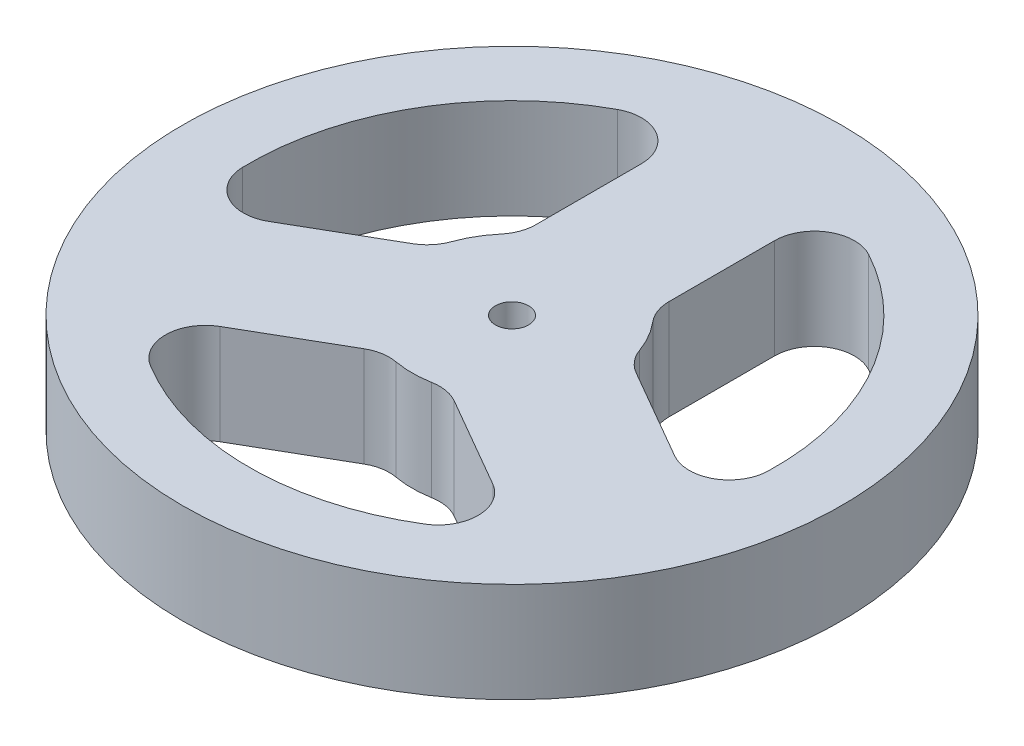
ISO-10303-21;
HEADER;
FILE_DESCRIPTION(('STEP AP214'),'2;1');
FILE_NAME('part.step','',(''),(''),'','','');
FILE_SCHEMA(('AUTOMOTIVE_DESIGN { 1 0 10303 214 1 1 1 1 }'));
ENDSEC;
DATA;
#1=APPLICATION_CONTEXT('core data for automotive mechanical design processes');
#2=APPLICATION_PROTOCOL_DEFINITION('international standard','automotive_design',2000,#1);
#3=PRODUCT_CONTEXT('',#1,'mechanical');
#4=PRODUCT('Part','Part','',(#3));
#5=PRODUCT_RELATED_PRODUCT_CATEGORY('part','',(#4));
#6=PRODUCT_DEFINITION_FORMATION('','',#4);
#7=PRODUCT_DEFINITION_CONTEXT('part definition',#1,'design');
#8=PRODUCT_DEFINITION('design','',#6,#7);
#9=PRODUCT_DEFINITION_SHAPE('','',#8);
#10=(LENGTH_UNIT() NAMED_UNIT(*) SI_UNIT(.MILLI.,.METRE.));
#11=(NAMED_UNIT(*) PLANE_ANGLE_UNIT() SI_UNIT($,.RADIAN.));
#12=(NAMED_UNIT(*) SI_UNIT($,.STERADIAN.) SOLID_ANGLE_UNIT());
#13=UNCERTAINTY_MEASURE_WITH_UNIT(LENGTH_MEASURE(1.E-05),#10,'distance_accuracy_value','');
#14=(GEOMETRIC_REPRESENTATION_CONTEXT(3) GLOBAL_UNCERTAINTY_ASSIGNED_CONTEXT((#13)) GLOBAL_UNIT_ASSIGNED_CONTEXT((#10,
#11,#12)) REPRESENTATION_CONTEXT('',''));
#15=CARTESIAN_POINT('',(0.,0.,0.));
#16=DIRECTION('',(0.,0.,1.));
#17=DIRECTION('',(1.,0.,0.));
#18=AXIS2_PLACEMENT_3D('',#15,#16,#17);
#19=CARTESIAN_POINT('',(0.,15.,0.));
#20=DIRECTION('',(0.,-1.,0.));
#21=DIRECTION('',(0.,0.,-1.));
#22=AXIS2_PLACEMENT_3D('',#19,#20,#21);
#23=CYLINDRICAL_SURFACE('',#22,15.);
#24=CARTESIAN_POINT('',(0.,15.,0.));
#25=DIRECTION('',(0.,1.,0.));
#26=DIRECTION('',(0.,0.,1.));
#27=AXIS2_PLACEMENT_3D('',#24,#25,#26);
#28=CIRCLE('',#27,15.);
#29=CARTESIAN_POINT('',(14.1280135638493,15.,-5.03976514727532));
#30=VERTEX_POINT('',#29);
#31=CARTESIAN_POINT('',(11.4285714285714,15.,-9.71533607766817));
#32=VERTEX_POINT('',#31);
#33=EDGE_CURVE('E358',#30,#32,#28,.T.);
#34=ORIENTED_EDGE('',*,*,#33,.F.);
#35=DIRECTION('',(0.,-1.,0.));
#36=VECTOR('',#35,1.);
#37=CARTESIAN_POINT('',(14.1280135638493,15.,-5.03976514727532));
#38=LINE('',#37,#36);
#39=CARTESIAN_POINT('',(14.1280135638493,0.,-5.03976514727532));
#40=VERTEX_POINT('',#39);
#41=EDGE_CURVE('E243',#30,#40,#38,.T.);
#42=ORIENTED_EDGE('',*,*,#41,.T.);
#43=CARTESIAN_POINT('',(0.,0.,0.));
#44=DIRECTION('',(0.,1.,0.));
#45=DIRECTION('',(0.,0.,1.));
#46=AXIS2_PLACEMENT_3D('',#43,#44,#45);
#47=CIRCLE('',#46,15.);
#48=CARTESIAN_POINT('',(11.4285714285714,0.,-9.71533607766817));
#49=VERTEX_POINT('',#48);
#50=EDGE_CURVE('E337',#40,#49,#47,.T.);
#51=ORIENTED_EDGE('',*,*,#50,.T.);
#52=DIRECTION('',(0.,-1.,0.));
#53=VECTOR('',#52,1.);
#54=CARTESIAN_POINT('',(11.4285714285714,15.,-9.71533607766817));
#55=LINE('',#54,#53);
#56=EDGE_CURVE('E241',#49,#32,#55,.F.);
#57=ORIENTED_EDGE('',*,*,#56,.T.);
#58=EDGE_LOOP('',(#34,#42,#51,#57));
#59=FACE_BOUND('',#58,.T.);
#60=ADVANCED_FACE('F37',(#59),#23,.T.);
#61=CARTESIAN_POINT('',(10.,15.,0.));
#62=DIRECTION('',(1.,0.,0.));
#63=DIRECTION('',(0.,0.,-1.));
#64=AXIS2_PLACEMENT_3D('',#61,#62,#63);
#65=PLANE('',#64);
#66=DIRECTION('',(0.,0.,1.));
#67=VECTOR('',#66,1.);
#68=CARTESIAN_POINT('',(10.,15.,0.));
#69=LINE('',#68,#67);
#70=CARTESIAN_POINT('',(10.,15.,-29.4321253055229));
#71=VERTEX_POINT('',#70);
#72=CARTESIAN_POINT('',(10.,15.,-13.6014705087354));
#73=VERTEX_POINT('',#72);
#74=EDGE_CURVE('E368',#71,#73,#69,.T.);
#75=ORIENTED_EDGE('',*,*,#74,.T.);
#76=DIRECTION('',(0.,-1.,0.));
#77=VECTOR('',#76,1.);
#78=CARTESIAN_POINT('',(10.,15.,-13.6014705087354));
#79=LINE('',#78,#77);
#80=CARTESIAN_POINT('',(10.,0.,-13.6014705087354));
#81=VERTEX_POINT('',#80);
#82=EDGE_CURVE('E267',#73,#81,#79,.T.);
#83=ORIENTED_EDGE('',*,*,#82,.T.);
#84=DIRECTION('',(0.,0.,1.));
#85=VECTOR('',#84,1.);
#86=CARTESIAN_POINT('',(10.,0.,0.));
#87=LINE('',#86,#85);
#88=CARTESIAN_POINT('',(10.,0.,-29.4321253055229));
#89=VERTEX_POINT('',#88);
#90=EDGE_CURVE('E385',#89,#81,#87,.T.);
#91=ORIENTED_EDGE('',*,*,#90,.F.);
#92=DIRECTION('',(0.,1.,0.));
#93=VECTOR('',#92,1.);
#94=CARTESIAN_POINT('',(10.,15.,-29.4321253055229));
#95=LINE('',#94,#93);
#96=EDGE_CURVE('E265',#89,#71,#95,.T.);
#97=ORIENTED_EDGE('',*,*,#96,.T.);
#98=EDGE_LOOP('',(#75,#83,#91,#97));
#99=FACE_BOUND('',#98,.T.);
#100=ADVANCED_FACE('F429',(#99),#65,.T.);
#101=CARTESIAN_POINT('',(0.,15.,0.));
#102=DIRECTION('',(0.,-1.,0.));
#103=DIRECTION('',(0.,0.,-1.));
#104=AXIS2_PLACEMENT_3D('',#101,#102,#103);
#105=CYLINDRICAL_SURFACE('',#104,39.5);
#106=CARTESIAN_POINT('',(0.,0.,0.));
#107=DIRECTION('',(0.,1.,0.));
#108=DIRECTION('',(0.,0.,1.));
#109=AXIS2_PLACEMENT_3D('',#106,#107,#108);
#110=CIRCLE('',#109,39.5);
#111=CARTESIAN_POINT('',(39.4869923575228,0.,1.01362446544014));
#112=VERTEX_POINT('',#111);
#113=CARTESIAN_POINT('',(18.865671641791,0.,-34.7035507333777));
#114=VERTEX_POINT('',#113);
#115=EDGE_CURVE('E340',#112,#114,#110,.T.);
#116=ORIENTED_EDGE('',*,*,#115,.F.);
#117=DIRECTION('',(0.,-1.,0.));
#118=VECTOR('',#117,1.);
#119=CARTESIAN_POINT('',(39.4869923575228,15.,1.01362446544014));
#120=LINE('',#119,#118);
#121=CARTESIAN_POINT('',(39.4869923575228,15.,1.01362446544014));
#122=VERTEX_POINT('',#121);
#123=EDGE_CURVE('E254',#112,#122,#120,.F.);
#124=ORIENTED_EDGE('',*,*,#123,.T.);
#125=CARTESIAN_POINT('',(0.,15.,0.));
#126=DIRECTION('',(0.,1.,0.));
#127=DIRECTION('',(0.,0.,1.));
#128=AXIS2_PLACEMENT_3D('',#125,#126,#127);
#129=CIRCLE('',#128,39.5);
#130=CARTESIAN_POINT('',(18.865671641791,15.,-34.7035507333777));
#131=VERTEX_POINT('',#130);
#132=EDGE_CURVE('E363',#122,#131,#129,.T.);
#133=ORIENTED_EDGE('',*,*,#132,.T.);
#134=DIRECTION('',(0.,-1.,0.));
#135=VECTOR('',#134,1.);
#136=CARTESIAN_POINT('',(18.865671641791,15.,-34.7035507333777));
#137=LINE('',#136,#135);
#138=EDGE_CURVE('E251',#131,#114,#137,.T.);
#139=ORIENTED_EDGE('',*,*,#138,.T.);
#140=EDGE_LOOP('',(#116,#124,#133,#139));
#141=FACE_BOUND('',#140,.T.);
#142=ADVANCED_FACE('F440',(#141),#105,.F.);
#143=CARTESIAN_POINT('',(-9.99999999999999,15.,0.));
#144=DIRECTION('',(1.,0.,0.));
#145=DIRECTION('',(0.,0.,-1.));
#146=AXIS2_PLACEMENT_3D('',#143,#144,#145);
#147=PLANE('',#146);
#148=DIRECTION('',(0.,0.,1.));
#149=VECTOR('',#148,1.);
#150=CARTESIAN_POINT('',(-9.99999999999999,0.,0.));
#151=LINE('',#150,#149);
#152=CARTESIAN_POINT('',(-10.,0.,-29.4321253055229));
#153=VERTEX_POINT('',#152);
#154=CARTESIAN_POINT('',(-10.,0.,-13.6014705087354));
#155=VERTEX_POINT('',#154);
#156=EDGE_CURVE('E332',#153,#155,#151,.T.);
#157=ORIENTED_EDGE('',*,*,#156,.T.);
#158=DIRECTION('',(0.,1.,0.));
#159=VECTOR('',#158,1.);
#160=CARTESIAN_POINT('',(-9.99999999999999,15.,-13.6014705087354));
#161=LINE('',#160,#159);
#162=CARTESIAN_POINT('',(-10.,15.,-13.6014705087354));
#163=VERTEX_POINT('',#162);
#164=EDGE_CURVE('E278',#155,#163,#161,.T.);
#165=ORIENTED_EDGE('',*,*,#164,.T.);
#166=DIRECTION('',(0.,0.,1.));
#167=VECTOR('',#166,1.);
#168=CARTESIAN_POINT('',(-9.99999999999999,15.,0.));
#169=LINE('',#168,#167);
#170=CARTESIAN_POINT('',(-10.,15.,-29.4321253055229));
#171=VERTEX_POINT('',#170);
#172=EDGE_CURVE('E346',#171,#163,#169,.T.);
#173=ORIENTED_EDGE('',*,*,#172,.F.);
#174=DIRECTION('',(0.,-1.,0.));
#175=VECTOR('',#174,1.);
#176=CARTESIAN_POINT('',(-10.,15.,-29.4321253055229));
#177=LINE('',#176,#175);
#178=EDGE_CURVE('E275',#171,#153,#177,.T.);
#179=ORIENTED_EDGE('',*,*,#178,.T.);
#180=EDGE_LOOP('',(#157,#165,#173,#179));
#181=FACE_BOUND('',#180,.T.);
#182=ADVANCED_FACE('F350',(#181),#147,.F.);
#183=CARTESIAN_POINT('',(-11.4285714285714,15.,-9.71533607766817));
#184=VERTEX_POINT('',#183);
#185=CARTESIAN_POINT('',(-14.1280135638507,15.,-5.03976514727127));
#186=VERTEX_POINT('',#185);
#187=EDGE_CURVE('E352',#184,#186,#28,.T.);
#188=ORIENTED_EDGE('',*,*,#187,.F.);
#189=DIRECTION('',(0.,-1.,0.));
#190=VECTOR('',#189,1.);
#191=CARTESIAN_POINT('',(-11.4285714285714,15.,-9.71533607766817));
#192=LINE('',#191,#190);
#193=CARTESIAN_POINT('',(-11.4285714285714,0.,-9.71533607766817));
#194=VERTEX_POINT('',#193);
#195=EDGE_CURVE('E272',#184,#194,#192,.T.);
#196=ORIENTED_EDGE('',*,*,#195,.T.);
#197=CARTESIAN_POINT('',(-14.1280135638507,0.,-5.03976514727127));
#198=VERTEX_POINT('',#197);
#199=EDGE_CURVE('E379',#194,#198,#47,.T.);
#200=ORIENTED_EDGE('',*,*,#199,.T.);
#201=DIRECTION('',(0.,-1.,0.));
#202=VECTOR('',#201,1.);
#203=CARTESIAN_POINT('',(-14.1280135638507,15.,-5.03976514727127));
#204=LINE('',#203,#202);
#205=EDGE_CURVE('E270',#198,#186,#204,.F.);
#206=ORIENTED_EDGE('',*,*,#205,.T.);
#207=EDGE_LOOP('',(#188,#196,#200,#206));
#208=FACE_BOUND('',#207,.T.);
#209=ADVANCED_FACE('F457',(#208),#23,.T.);
#210=CARTESIAN_POINT('',(-4.9999999999988,15.,-8.6602540378423));
#211=DIRECTION('',(-0.500000000000001,0.,-0.866025403784438));
#212=DIRECTION('',(-0.866025403784438,0.,0.500000000000001));
#213=AXIS2_PLACEMENT_3D('',#210,#211,#212);
#214=PLANE('',#213);
#215=DIRECTION('',(0.866025403784438,0.,-0.500000000000001));
#216=VECTOR('',#215,1.);
#217=CARTESIAN_POINT('',(-4.9999999999988,15.,-8.6602540378423));
#218=LINE('',#217,#216);
#219=CARTESIAN_POINT('',(-30.4889682019496,15.,6.05580861491981));
#220=VERTEX_POINT('',#219);
#221=CARTESIAN_POINT('',(-16.779218989391,15.,-1.85951878347315));
#222=VERTEX_POINT('',#221);
#223=EDGE_CURVE('E356',#220,#222,#218,.T.);
#224=ORIENTED_EDGE('',*,*,#223,.T.);
#225=DIRECTION('',(0.,-1.,0.));
#226=VECTOR('',#225,1.);
#227=CARTESIAN_POINT('',(-16.779218989391,15.,-1.85951878347315));
#228=LINE('',#227,#226);
#229=CARTESIAN_POINT('',(-16.779218989391,0.,-1.85951878347315));
#230=VERTEX_POINT('',#229);
#231=EDGE_CURVE('E282',#222,#230,#228,.T.);
#232=ORIENTED_EDGE('',*,*,#231,.T.);
#233=DIRECTION('',(0.866025403784438,0.,-0.500000000000001));
#234=VECTOR('',#233,1.);
#235=CARTESIAN_POINT('',(-4.9999999999988,0.,-8.6602540378423));
#236=LINE('',#235,#234);
#237=CARTESIAN_POINT('',(-30.4889682019496,0.,6.05580861491981));
#238=VERTEX_POINT('',#237);
#239=EDGE_CURVE('E338',#238,#230,#236,.T.);
#240=ORIENTED_EDGE('',*,*,#239,.F.);
#241=DIRECTION('',(0.,1.,0.));
#242=VECTOR('',#241,1.);
#243=CARTESIAN_POINT('',(-30.4889682019496,15.,6.05580861491981));
#244=LINE('',#243,#242);
#245=EDGE_CURVE('E280',#238,#220,#244,.T.);
#246=ORIENTED_EDGE('',*,*,#245,.T.);
#247=EDGE_LOOP('',(#224,#232,#240,#246));
#248=FACE_BOUND('',#247,.T.);
#249=ADVANCED_FACE('F448',(#248),#214,.T.);
#250=CARTESIAN_POINT('',(5.00000000000121,15.,8.66025403784647));
#251=DIRECTION('',(-0.500000000000001,0.,-0.866025403784438));
#252=DIRECTION('',(-0.866025403784438,0.,0.500000000000001));
#253=AXIS2_PLACEMENT_3D('',#250,#251,#252);
#254=PLANE('',#253);
#255=DIRECTION('',(0.866025403784438,0.,-0.500000000000001));
#256=VECTOR('',#255,1.);
#257=CARTESIAN_POINT('',(5.00000000000121,0.,8.66025403784647));
#258=LINE('',#257,#256);
#259=CARTESIAN_POINT('',(-20.4889682019473,0.,23.3763166906073));
#260=VERTEX_POINT('',#259);
#261=CARTESIAN_POINT('',(-6.77921898938609,0.,15.4609892922128));
#262=VERTEX_POINT('',#261);
#263=EDGE_CURVE('E376',#260,#262,#258,.T.);
#264=ORIENTED_EDGE('',*,*,#263,.T.);
#265=DIRECTION('',(0.,1.,0.));
#266=VECTOR('',#265,1.);
#267=CARTESIAN_POINT('',(-6.77921898938608,15.,15.4609892922128));
#268=LINE('',#267,#266);
#269=CARTESIAN_POINT('',(-6.77921898938609,15.,15.4609892922128));
#270=VERTEX_POINT('',#269);
#271=EDGE_CURVE('E263',#262,#270,#268,.T.);
#272=ORIENTED_EDGE('',*,*,#271,.T.);
#273=DIRECTION('',(0.866025403784438,0.,-0.500000000000001));
#274=VECTOR('',#273,1.);
#275=CARTESIAN_POINT('',(5.00000000000121,15.,8.66025403784647));
#276=LINE('',#275,#274);
#277=CARTESIAN_POINT('',(-20.4889682019473,15.,23.3763166906073));
#278=VERTEX_POINT('',#277);
#279=EDGE_CURVE('E395',#278,#270,#276,.T.);
#280=ORIENTED_EDGE('',*,*,#279,.F.);
#281=DIRECTION('',(0.,-1.,0.));
#282=VECTOR('',#281,1.);
#283=CARTESIAN_POINT('',(-20.4889682019473,15.,23.3763166906073));
#284=LINE('',#283,#282);
#285=EDGE_CURVE('E260',#278,#260,#284,.T.);
#286=ORIENTED_EDGE('',*,*,#285,.T.);
#287=EDGE_LOOP('',(#264,#272,#280,#286));
#288=FACE_BOUND('',#287,.T.);
#289=ADVANCED_FACE('F479',(#288),#254,.F.);
#290=CARTESIAN_POINT('',(-2.69944213527577,0.,14.7551012249424));
#291=VERTEX_POINT('',#290);
#292=CARTESIAN_POINT('',(2.69944213527999,0.,14.7551012249417));
#293=VERTEX_POINT('',#292);
#294=EDGE_CURVE('E222',#291,#293,#47,.T.);
#295=ORIENTED_EDGE('',*,*,#294,.T.);
#296=DIRECTION('',(0.,-1.,0.));
#297=VECTOR('',#296,1.);
#298=CARTESIAN_POINT('',(2.69944213528,15.,14.7551012249417));
#299=LINE('',#298,#297);
#300=CARTESIAN_POINT('',(2.69944213527999,15.,14.7551012249417));
#301=VERTEX_POINT('',#300);
#302=EDGE_CURVE('E239',#293,#301,#299,.F.);
#303=ORIENTED_EDGE('',*,*,#302,.T.);
#304=CARTESIAN_POINT('',(-2.69944213527577,15.,14.7551012249424));
#305=VERTEX_POINT('',#304);
#306=EDGE_CURVE('E359',#305,#301,#28,.T.);
#307=ORIENTED_EDGE('',*,*,#306,.F.);
#308=DIRECTION('',(0.,-1.,0.));
#309=VECTOR('',#308,1.);
#310=CARTESIAN_POINT('',(-2.69944213527577,15.,14.7551012249424));
#311=LINE('',#310,#309);
#312=EDGE_CURVE('E228',#305,#291,#311,.T.);
#313=ORIENTED_EDGE('',*,*,#312,.T.);
#314=EDGE_LOOP('',(#295,#303,#307,#313));
#315=FACE_BOUND('',#314,.T.);
#316=ADVANCED_FACE('F411',(#315),#23,.T.);
#317=CARTESIAN_POINT('',(-4.99999999999926,15.,8.66025403784311));
#318=DIRECTION('',(-0.5,0.,0.866025403784439));
#319=DIRECTION('',(0.866025403784439,0.,0.5));
#320=AXIS2_PLACEMENT_3D('',#317,#318,#319);
#321=PLANE('',#320);
#322=DIRECTION('',(-0.866025403784439,0.,-0.5));
#323=VECTOR('',#322,1.);
#324=CARTESIAN_POINT('',(-4.99999999999926,15.,8.66025403784311));
#325=LINE('',#324,#323);
#326=CARTESIAN_POINT('',(20.4889682019511,15.,23.3763166906049));
#327=VERTEX_POINT('',#326);
#328=CARTESIAN_POINT('',(6.77921898939199,15.,15.4609892922117));
#329=VERTEX_POINT('',#328);
#330=EDGE_CURVE('E361',#327,#329,#325,.T.);
#331=ORIENTED_EDGE('',*,*,#330,.T.);
#332=DIRECTION('',(0.,-1.,0.));
#333=VECTOR('',#332,1.);
#334=CARTESIAN_POINT('',(6.77921898939199,15.,15.4609892922117));
#335=LINE('',#334,#333);
#336=CARTESIAN_POINT('',(6.77921898939199,0.,15.4609892922117));
#337=VERTEX_POINT('',#336);
#338=EDGE_CURVE('E221',#329,#337,#335,.T.);
#339=ORIENTED_EDGE('',*,*,#338,.T.);
#340=DIRECTION('',(-0.866025403784439,0.,-0.5));
#341=VECTOR('',#340,1.);
#342=CARTESIAN_POINT('',(-4.99999999999926,0.,8.66025403784311));
#343=LINE('',#342,#341);
#344=CARTESIAN_POINT('',(20.4889682019511,0.,23.3763166906049));
#345=VERTEX_POINT('',#344);
#346=EDGE_CURVE('E204',#345,#337,#343,.T.);
#347=ORIENTED_EDGE('',*,*,#346,.F.);
#348=DIRECTION('',(0.,1.,0.));
#349=VECTOR('',#348,1.);
#350=CARTESIAN_POINT('',(20.4889682019511,15.,23.3763166906049));
#351=LINE('',#350,#349);
#352=EDGE_CURVE('E218',#345,#327,#351,.T.);
#353=ORIENTED_EDGE('',*,*,#352,.T.);
#354=EDGE_LOOP('',(#331,#339,#347,#353));
#355=FACE_BOUND('',#354,.T.);
#356=ADVANCED_FACE('F217',(#355),#321,.T.);
#357=CARTESIAN_POINT('',(0.,15.,0.));
#358=DIRECTION('',(0.,-1.,0.));
#359=DIRECTION('',(0.,0.,-1.));
#360=AXIS2_PLACEMENT_3D('',#357,#358,#359);
#361=CYLINDRICAL_SURFACE('',#360,49.5);
#362=CARTESIAN_POINT('',(0.,15.,0.));
#363=DIRECTION('',(0.,1.,0.));
#364=DIRECTION('',(0.,0.,1.));
#365=AXIS2_PLACEMENT_3D('',#362,#363,#364);
#366=CIRCLE('',#365,49.5);
#367=CARTESIAN_POINT('',(0.,15.,49.5));
#368=VERTEX_POINT('',#367);
#369=EDGE_CURVE('E231',#368,#368,#366,.T.);
#370=ORIENTED_EDGE('',*,*,#369,.F.);
#371=EDGE_LOOP('',(#370));
#372=FACE_BOUND('',#371,.T.);
#373=CARTESIAN_POINT('',(0.,0.,0.));
#374=DIRECTION('',(0.,1.,0.));
#375=DIRECTION('',(0.,0.,1.));
#376=AXIS2_PLACEMENT_3D('',#373,#374,#375);
#377=CIRCLE('',#376,49.5);
#378=CARTESIAN_POINT('',(0.,0.,49.5));
#379=VERTEX_POINT('',#378);
#380=EDGE_CURVE('E390',#379,#379,#377,.T.);
#381=ORIENTED_EDGE('',*,*,#380,.T.);
#382=EDGE_LOOP('',(#381));
#383=FACE_BOUND('',#382,.T.);
#384=ADVANCED_FACE('F494',(#372,#383),#361,.T.);
#385=CARTESIAN_POINT('',(5.00000000000074,15.,-8.66025403784567));
#386=DIRECTION('',(-0.5,0.,0.866025403784439));
#387=DIRECTION('',(0.866025403784439,0.,0.5));
#388=AXIS2_PLACEMENT_3D('',#385,#386,#387);
#389=PLANE('',#388);
#390=DIRECTION('',(-0.866025403784439,0.,-0.5));
#391=VECTOR('',#390,1.);
#392=CARTESIAN_POINT('',(5.00000000000074,0.,-8.66025403784567));
#393=LINE('',#392,#391);
#394=CARTESIAN_POINT('',(30.4889682019497,0.,6.05580861491536));
#395=VERTEX_POINT('',#394);
#396=CARTESIAN_POINT('',(16.779218989389,0.,-1.85951878347882));
#397=VERTEX_POINT('',#396);
#398=EDGE_CURVE('E388',#395,#397,#393,.T.);
#399=ORIENTED_EDGE('',*,*,#398,.T.);
#400=DIRECTION('',(0.,1.,0.));
#401=VECTOR('',#400,1.);
#402=CARTESIAN_POINT('',(16.779218989389,15.,-1.85951878347882));
#403=LINE('',#402,#401);
#404=CARTESIAN_POINT('',(16.779218989389,15.,-1.85951878347882));
#405=VERTEX_POINT('',#404);
#406=EDGE_CURVE('E249',#397,#405,#403,.T.);
#407=ORIENTED_EDGE('',*,*,#406,.T.);
#408=DIRECTION('',(-0.866025403784439,0.,-0.5));
#409=VECTOR('',#408,1.);
#410=CARTESIAN_POINT('',(5.00000000000074,15.,-8.66025403784567));
#411=LINE('',#410,#409);
#412=CARTESIAN_POINT('',(30.4889682019497,15.,6.05580861491536));
#413=VERTEX_POINT('',#412);
#414=EDGE_CURVE('E371',#413,#405,#411,.T.);
#415=ORIENTED_EDGE('',*,*,#414,.F.);
#416=DIRECTION('',(0.,-1.,0.));
#417=VECTOR('',#416,1.);
#418=CARTESIAN_POINT('',(30.4889682019497,15.,6.05580861491536));
#419=LINE('',#418,#417);
#420=EDGE_CURVE('E246',#413,#395,#419,.T.);
#421=ORIENTED_EDGE('',*,*,#420,.T.);
#422=EDGE_LOOP('',(#399,#407,#415,#421));
#423=FACE_BOUND('',#422,.T.);
#424=ADVANCED_FACE('F530',(#423),#389,.F.);
#425=CARTESIAN_POINT('',(-18.865671641791,15.,-34.7035507333777));
#426=VERTEX_POINT('',#425);
#427=CARTESIAN_POINT('',(-39.4869923575226,15.,1.0136244654454));
#428=VERTEX_POINT('',#427);
#429=EDGE_CURVE('E348',#426,#428,#129,.T.);
#430=ORIENTED_EDGE('',*,*,#429,.T.);
#431=DIRECTION('',(0.,-1.,0.));
#432=VECTOR('',#431,1.);
#433=CARTESIAN_POINT('',(-39.4869923575226,15.,1.0136244654454));
#434=LINE('',#433,#432);
#435=CARTESIAN_POINT('',(-39.4869923575226,0.,1.0136244654454));
#436=VERTEX_POINT('',#435);
#437=EDGE_CURVE('E286',#428,#436,#434,.T.);
#438=ORIENTED_EDGE('',*,*,#437,.T.);
#439=CARTESIAN_POINT('',(-18.865671641791,0.,-34.7035507333777));
#440=VERTEX_POINT('',#439);
#441=EDGE_CURVE('E330',#440,#436,#110,.T.);
#442=ORIENTED_EDGE('',*,*,#441,.F.);
#443=DIRECTION('',(0.,-1.,0.));
#444=VECTOR('',#443,1.);
#445=CARTESIAN_POINT('',(-18.865671641791,15.,-34.7035507333777));
#446=LINE('',#445,#444);
#447=EDGE_CURVE('E59',#440,#426,#446,.F.);
#448=ORIENTED_EDGE('',*,*,#447,.T.);
#449=EDGE_LOOP('',(#430,#438,#442,#448));
#450=FACE_BOUND('',#449,.T.);
#451=ADVANCED_FACE('F335',(#450),#105,.F.);
#452=CARTESIAN_POINT('',(-20.6213207157289,15.,33.6899262679373));
#453=VERTEX_POINT('',#452);
#454=CARTESIAN_POINT('',(20.6213207157334,15.,33.6899262679345));
#455=VERTEX_POINT('',#454);
#456=EDGE_CURVE('E353',#453,#455,#129,.T.);
#457=ORIENTED_EDGE('',*,*,#456,.T.);
#458=DIRECTION('',(0.,-1.,0.));
#459=VECTOR('',#458,1.);
#460=CARTESIAN_POINT('',(20.6213207157334,15.,33.6899262679345));
#461=LINE('',#460,#459);
#462=CARTESIAN_POINT('',(20.6213207157334,0.,33.6899262679345));
#463=VERTEX_POINT('',#462);
#464=EDGE_CURVE('E258',#455,#463,#461,.T.);
#465=ORIENTED_EDGE('',*,*,#464,.T.);
#466=CARTESIAN_POINT('',(-20.6213207157289,0.,33.6899262679373));
#467=VERTEX_POINT('',#466);
#468=EDGE_CURVE('E206',#467,#463,#110,.T.);
#469=ORIENTED_EDGE('',*,*,#468,.F.);
#470=DIRECTION('',(0.,-1.,0.));
#471=VECTOR('',#470,1.);
#472=CARTESIAN_POINT('',(-20.6213207157289,15.,33.6899262679373));
#473=LINE('',#472,#471);
#474=EDGE_CURVE('E256',#467,#453,#473,.F.);
#475=ORIENTED_EDGE('',*,*,#474,.T.);
#476=EDGE_LOOP('',(#457,#465,#469,#475));
#477=FACE_BOUND('',#476,.T.);
#478=ADVANCED_FACE('F490',(#477),#105,.F.);
#479=CARTESIAN_POINT('',(0.,15.,0.));
#480=DIRECTION('',(0.,-1.,0.));
#481=DIRECTION('',(0.,0.,-1.));
#482=AXIS2_PLACEMENT_3D('',#479,#480,#481);
#483=CYLINDRICAL_SURFACE('',#482,2.5);
#484=CARTESIAN_POINT('',(0.,15.,0.));
#485=DIRECTION('',(0.,1.,0.));
#486=DIRECTION('',(0.,0.,1.));
#487=AXIS2_PLACEMENT_3D('',#484,#485,#486);
#488=CIRCLE('',#487,2.5);
#489=CARTESIAN_POINT('',(0.,15.,2.5));
#490=VERTEX_POINT('',#489);
#491=EDGE_CURVE('E226',#490,#490,#488,.T.);
#492=ORIENTED_EDGE('',*,*,#491,.T.);
#493=EDGE_LOOP('',(#492));
#494=FACE_BOUND('',#493,.T.);
#495=CARTESIAN_POINT('',(0.,0.,0.));
#496=DIRECTION('',(0.,1.,0.));
#497=DIRECTION('',(0.,0.,1.));
#498=AXIS2_PLACEMENT_3D('',#495,#496,#497);
#499=CIRCLE('',#498,2.5);
#500=CARTESIAN_POINT('',(0.,0.,2.5));
#501=VERTEX_POINT('',#500);
#502=EDGE_CURVE('E234',#501,#501,#499,.T.);
#503=ORIENTED_EDGE('',*,*,#502,.F.);
#504=EDGE_LOOP('',(#503));
#505=FACE_BOUND('',#504,.T.);
#506=ADVANCED_FACE('F518',(#494,#505),#483,.F.);
#507=CARTESIAN_POINT('',(0.,15.,0.));
#508=DIRECTION('',(0.,1.,0.));
#509=DIRECTION('',(0.,0.,1.));
#510=AXIS2_PLACEMENT_3D('',#507,#508,#509);
#511=PLANE('',#510);
#512=ORIENTED_EDGE('',*,*,#456,.F.);
#513=CARTESIAN_POINT('',(-17.4889682019473,15.,28.5724691133139));
#514=DIRECTION('',(0.,1.,0.));
#515=DIRECTION('',(0.,0.,1.));
#516=AXIS2_PLACEMENT_3D('',#513,#514,#515);
#517=CIRCLE('',#516,6.);
#518=EDGE_CURVE('E319',#453,#278,#517,.F.);
#519=ORIENTED_EDGE('',*,*,#518,.T.);
#520=ORIENTED_EDGE('',*,*,#279,.T.);
#521=CARTESIAN_POINT('',(-3.77921898938608,15.,20.6571417149194));
#522=DIRECTION('',(0.,1.,0.));
#523=DIRECTION('',(0.,0.,1.));
#524=AXIS2_PLACEMENT_3D('',#521,#522,#523);
#525=CIRCLE('',#524,6.);
#526=EDGE_CURVE('E303',#270,#305,#525,.F.);
#527=ORIENTED_EDGE('',*,*,#526,.T.);
#528=ORIENTED_EDGE('',*,*,#306,.T.);
#529=CARTESIAN_POINT('',(3.77921898939199,15.,20.6571417149183));
#530=DIRECTION('',(0.,1.,0.));
#531=DIRECTION('',(0.,0.,1.));
#532=AXIS2_PLACEMENT_3D('',#529,#530,#531);
#533=CIRCLE('',#532,6.);
#534=EDGE_CURVE('E291',#301,#329,#533,.F.);
#535=ORIENTED_EDGE('',*,*,#534,.T.);
#536=ORIENTED_EDGE('',*,*,#330,.F.);
#537=CARTESIAN_POINT('',(17.4889682019511,15.,28.5724691133116));
#538=DIRECTION('',(0.,1.,0.));
#539=DIRECTION('',(0.,0.,1.));
#540=AXIS2_PLACEMENT_3D('',#537,#538,#539);
#541=CIRCLE('',#540,6.);
#542=EDGE_CURVE('E211',#327,#455,#541,.F.);
#543=ORIENTED_EDGE('',*,*,#542,.T.);
#544=EDGE_LOOP('',(#512,#519,#520,#527,#528,#535,#536,#543));
#545=FACE_BOUND('',#544,.T.);
#546=ORIENTED_EDGE('',*,*,#429,.F.);
#547=CARTESIAN_POINT('',(-16.,15.,-29.4321253055229));
#548=DIRECTION('',(0.,1.,0.));
#549=DIRECTION('',(0.,0.,1.));
#550=AXIS2_PLACEMENT_3D('',#547,#548,#549);
#551=CIRCLE('',#550,6.);
#552=EDGE_CURVE('E11',#426,#171,#551,.F.);
#553=ORIENTED_EDGE('',*,*,#552,.T.);
#554=ORIENTED_EDGE('',*,*,#172,.T.);
#555=CARTESIAN_POINT('',(-16.,15.,-13.6014705087354));
#556=DIRECTION('',(0.,1.,0.));
#557=DIRECTION('',(0.,0.,1.));
#558=AXIS2_PLACEMENT_3D('',#555,#556,#557);
#559=CIRCLE('',#558,6.);
#560=EDGE_CURVE('E311',#163,#184,#559,.F.);
#561=ORIENTED_EDGE('',*,*,#560,.T.);
#562=ORIENTED_EDGE('',*,*,#187,.T.);
#563=CARTESIAN_POINT('',(-19.779218989391,15.,-7.05567120617978));
#564=DIRECTION('',(0.,1.,0.));
#565=DIRECTION('',(0.,0.,1.));
#566=AXIS2_PLACEMENT_3D('',#563,#564,#565);
#567=CIRCLE('',#566,6.);
#568=EDGE_CURVE('E315',#186,#222,#567,.F.);
#569=ORIENTED_EDGE('',*,*,#568,.T.);
#570=ORIENTED_EDGE('',*,*,#223,.F.);
#571=CARTESIAN_POINT('',(-33.4889682019496,15.,0.859656192213185));
#572=DIRECTION('',(0.,1.,0.));
#573=DIRECTION('',(0.,0.,1.));
#574=AXIS2_PLACEMENT_3D('',#571,#572,#573);
#575=CIRCLE('',#574,6.);
#576=EDGE_CURVE('E52',#220,#428,#575,.F.);
#577=ORIENTED_EDGE('',*,*,#576,.T.);
#578=EDGE_LOOP('',(#546,#553,#554,#561,#562,#569,#570,#577));
#579=FACE_BOUND('',#578,.T.);
#580=ORIENTED_EDGE('',*,*,#414,.T.);
#581=CARTESIAN_POINT('',(19.779218989389,15.,-7.05567120618545));
#582=DIRECTION('',(0.,1.,0.));
#583=DIRECTION('',(0.,0.,1.));
#584=AXIS2_PLACEMENT_3D('',#581,#582,#583);
#585=CIRCLE('',#584,6.);
#586=EDGE_CURVE('E295',#405,#30,#585,.F.);
#587=ORIENTED_EDGE('',*,*,#586,.T.);
#588=ORIENTED_EDGE('',*,*,#33,.T.);
#589=CARTESIAN_POINT('',(16.,15.,-13.6014705087354));
#590=DIRECTION('',(0.,1.,0.));
#591=DIRECTION('',(0.,0.,1.));
#592=AXIS2_PLACEMENT_3D('',#589,#590,#591);
#593=CIRCLE('',#592,6.);
#594=EDGE_CURVE('E307',#32,#73,#593,.F.);
#595=ORIENTED_EDGE('',*,*,#594,.T.);
#596=ORIENTED_EDGE('',*,*,#74,.F.);
#597=CARTESIAN_POINT('',(16.,15.,-29.4321253055229));
#598=DIRECTION('',(0.,1.,0.));
#599=DIRECTION('',(0.,0.,1.));
#600=AXIS2_PLACEMENT_3D('',#597,#598,#599);
#601=CIRCLE('',#600,6.);
#602=EDGE_CURVE('E326',#71,#131,#601,.F.);
#603=ORIENTED_EDGE('',*,*,#602,.T.);
#604=ORIENTED_EDGE('',*,*,#132,.F.);
#605=CARTESIAN_POINT('',(33.4889682019497,15.,0.85965619220873));
#606=DIRECTION('',(0.,1.,0.));
#607=DIRECTION('',(0.,0.,1.));
#608=AXIS2_PLACEMENT_3D('',#605,#606,#607);
#609=CIRCLE('',#608,6.);
#610=EDGE_CURVE('E212',#122,#413,#609,.F.);
#611=ORIENTED_EDGE('',*,*,#610,.T.);
#612=EDGE_LOOP('',(#580,#587,#588,#595,#596,#603,#604,#611));
#613=FACE_BOUND('',#612,.T.);
#614=ORIENTED_EDGE('',*,*,#369,.T.);
#615=EDGE_LOOP('',(#614));
#616=FACE_BOUND('',#615,.T.);
#617=ORIENTED_EDGE('',*,*,#491,.F.);
#618=EDGE_LOOP('',(#617));
#619=FACE_BOUND('',#618,.T.);
#620=ADVANCED_FACE('F344',(#545,#579,#613,#616,#619),#511,.T.);
#621=CARTESIAN_POINT('',(0.,0.,0.));
#622=DIRECTION('',(0.,1.,0.));
#623=DIRECTION('',(0.,0.,1.));
#624=AXIS2_PLACEMENT_3D('',#621,#622,#623);
#625=PLANE('',#624);
#626=ORIENTED_EDGE('',*,*,#263,.F.);
#627=CARTESIAN_POINT('',(-17.4889682019473,0.,28.5724691133139));
#628=DIRECTION('',(0.,1.,0.));
#629=DIRECTION('',(0.,0.,1.));
#630=AXIS2_PLACEMENT_3D('',#627,#628,#629);
#631=CIRCLE('',#630,6.);
#632=EDGE_CURVE('E317',#260,#467,#631,.T.);
#633=ORIENTED_EDGE('',*,*,#632,.T.);
#634=ORIENTED_EDGE('',*,*,#468,.T.);
#635=CARTESIAN_POINT('',(17.4889682019511,0.,28.5724691133116));
#636=DIRECTION('',(0.,1.,0.));
#637=DIRECTION('',(0.,0.,1.));
#638=AXIS2_PLACEMENT_3D('',#635,#636,#637);
#639=CIRCLE('',#638,6.);
#640=EDGE_CURVE('E199',#463,#345,#639,.T.);
#641=ORIENTED_EDGE('',*,*,#640,.T.);
#642=ORIENTED_EDGE('',*,*,#346,.T.);
#643=CARTESIAN_POINT('',(3.77921898939199,0.,20.6571417149183));
#644=DIRECTION('',(0.,1.,0.));
#645=DIRECTION('',(0.,0.,1.));
#646=AXIS2_PLACEMENT_3D('',#643,#644,#645);
#647=CIRCLE('',#646,6.);
#648=EDGE_CURVE('E289',#337,#293,#647,.T.);
#649=ORIENTED_EDGE('',*,*,#648,.T.);
#650=ORIENTED_EDGE('',*,*,#294,.F.);
#651=CARTESIAN_POINT('',(-3.77921898938608,0.,20.6571417149194));
#652=DIRECTION('',(0.,1.,0.));
#653=DIRECTION('',(0.,0.,1.));
#654=AXIS2_PLACEMENT_3D('',#651,#652,#653);
#655=CIRCLE('',#654,6.);
#656=EDGE_CURVE('E301',#291,#262,#655,.T.);
#657=ORIENTED_EDGE('',*,*,#656,.T.);
#658=EDGE_LOOP('',(#626,#633,#634,#641,#642,#649,#650,#657));
#659=FACE_BOUND('',#658,.T.);
#660=ORIENTED_EDGE('',*,*,#156,.F.);
#661=CARTESIAN_POINT('',(-16.,0.,-29.4321253055229));
#662=DIRECTION('',(0.,1.,0.));
#663=DIRECTION('',(0.,0.,1.));
#664=AXIS2_PLACEMENT_3D('',#661,#662,#663);
#665=CIRCLE('',#664,6.);
#666=EDGE_CURVE('E45',#153,#440,#665,.T.);
#667=ORIENTED_EDGE('',*,*,#666,.T.);
#668=ORIENTED_EDGE('',*,*,#441,.T.);
#669=CARTESIAN_POINT('',(-33.4889682019496,0.,0.859656192213185));
#670=DIRECTION('',(0.,1.,0.));
#671=DIRECTION('',(0.,0.,1.));
#672=AXIS2_PLACEMENT_3D('',#669,#670,#671);
#673=CIRCLE('',#672,6.);
#674=EDGE_CURVE('E321',#436,#238,#673,.T.);
#675=ORIENTED_EDGE('',*,*,#674,.T.);
#676=ORIENTED_EDGE('',*,*,#239,.T.);
#677=CARTESIAN_POINT('',(-19.779218989391,0.,-7.05567120617978));
#678=DIRECTION('',(0.,1.,0.));
#679=DIRECTION('',(0.,0.,1.));
#680=AXIS2_PLACEMENT_3D('',#677,#678,#679);
#681=CIRCLE('',#680,6.);
#682=EDGE_CURVE('E313',#230,#198,#681,.T.);
#683=ORIENTED_EDGE('',*,*,#682,.T.);
#684=ORIENTED_EDGE('',*,*,#199,.F.);
#685=CARTESIAN_POINT('',(-16.,0.,-13.6014705087354));
#686=DIRECTION('',(0.,1.,0.));
#687=DIRECTION('',(0.,0.,1.));
#688=AXIS2_PLACEMENT_3D('',#685,#686,#687);
#689=CIRCLE('',#688,6.);
#690=EDGE_CURVE('E309',#194,#155,#689,.T.);
#691=ORIENTED_EDGE('',*,*,#690,.T.);
#692=EDGE_LOOP('',(#660,#667,#668,#675,#676,#683,#684,#691));
#693=FACE_BOUND('',#692,.T.);
#694=ORIENTED_EDGE('',*,*,#50,.F.);
#695=CARTESIAN_POINT('',(19.779218989389,0.,-7.05567120618545));
#696=DIRECTION('',(0.,1.,0.));
#697=DIRECTION('',(0.,0.,1.));
#698=AXIS2_PLACEMENT_3D('',#695,#696,#697);
#699=CIRCLE('',#698,6.);
#700=EDGE_CURVE('E293',#40,#397,#699,.T.);
#701=ORIENTED_EDGE('',*,*,#700,.T.);
#702=ORIENTED_EDGE('',*,*,#398,.F.);
#703=CARTESIAN_POINT('',(33.4889682019497,0.,0.85965619220873));
#704=DIRECTION('',(0.,1.,0.));
#705=DIRECTION('',(0.,0.,1.));
#706=AXIS2_PLACEMENT_3D('',#703,#704,#705);
#707=CIRCLE('',#706,6.);
#708=EDGE_CURVE('E297',#395,#112,#707,.T.);
#709=ORIENTED_EDGE('',*,*,#708,.T.);
#710=ORIENTED_EDGE('',*,*,#115,.T.);
#711=CARTESIAN_POINT('',(16.,0.,-29.4321253055229));
#712=DIRECTION('',(0.,1.,0.));
#713=DIRECTION('',(0.,0.,1.));
#714=AXIS2_PLACEMENT_3D('',#711,#712,#713);
#715=CIRCLE('',#714,6.);
#716=EDGE_CURVE('E324',#114,#89,#715,.T.);
#717=ORIENTED_EDGE('',*,*,#716,.T.);
#718=ORIENTED_EDGE('',*,*,#90,.T.);
#719=CARTESIAN_POINT('',(16.,0.,-13.6014705087354));
#720=DIRECTION('',(0.,1.,0.));
#721=DIRECTION('',(0.,0.,1.));
#722=AXIS2_PLACEMENT_3D('',#719,#720,#721);
#723=CIRCLE('',#722,6.);
#724=EDGE_CURVE('E305',#81,#49,#723,.T.);
#725=ORIENTED_EDGE('',*,*,#724,.T.);
#726=EDGE_LOOP('',(#694,#701,#702,#709,#710,#717,#718,#725));
#727=FACE_BOUND('',#726,.T.);
#728=ORIENTED_EDGE('',*,*,#380,.F.);
#729=EDGE_LOOP('',(#728));
#730=FACE_BOUND('',#729,.T.);
#731=ORIENTED_EDGE('',*,*,#502,.T.);
#732=EDGE_LOOP('',(#731));
#733=FACE_BOUND('',#732,.T.);
#734=ADVANCED_FACE('F202',(#659,#693,#727,#730,#733),#625,.F.);
#735=CARTESIAN_POINT('',(3.77921898939199,15.,20.6571417149183));
#736=DIRECTION('',(0.,-1.,0.));
#737=DIRECTION('',(0.,0.,-1.));
#738=AXIS2_PLACEMENT_3D('',#735,#736,#737);
#739=CYLINDRICAL_SURFACE('',#738,6.);
#740=ORIENTED_EDGE('',*,*,#534,.F.);
#741=ORIENTED_EDGE('',*,*,#302,.F.);
#742=ORIENTED_EDGE('',*,*,#648,.F.);
#743=ORIENTED_EDGE('',*,*,#338,.F.);
#744=EDGE_LOOP('',(#740,#741,#742,#743));
#745=FACE_BOUND('',#744,.T.);
#746=ADVANCED_FACE('F406',(#745),#739,.F.);
#747=CARTESIAN_POINT('',(19.779218989389,15.,-7.05567120618545));
#748=DIRECTION('',(0.,-1.,0.));
#749=DIRECTION('',(0.,0.,-1.));
#750=AXIS2_PLACEMENT_3D('',#747,#748,#749);
#751=CYLINDRICAL_SURFACE('',#750,6.);
#752=ORIENTED_EDGE('',*,*,#586,.F.);
#753=ORIENTED_EDGE('',*,*,#406,.F.);
#754=ORIENTED_EDGE('',*,*,#700,.F.);
#755=ORIENTED_EDGE('',*,*,#41,.F.);
#756=EDGE_LOOP('',(#752,#753,#754,#755));
#757=FACE_BOUND('',#756,.T.);
#758=ADVANCED_FACE('F500',(#757),#751,.F.);
#759=CARTESIAN_POINT('',(33.4889682019497,15.,0.85965619220873));
#760=DIRECTION('',(0.,-1.,0.));
#761=DIRECTION('',(0.,0.,-1.));
#762=AXIS2_PLACEMENT_3D('',#759,#760,#761);
#763=CYLINDRICAL_SURFACE('',#762,6.);
#764=ORIENTED_EDGE('',*,*,#610,.F.);
#765=ORIENTED_EDGE('',*,*,#123,.F.);
#766=ORIENTED_EDGE('',*,*,#708,.F.);
#767=ORIENTED_EDGE('',*,*,#420,.F.);
#768=EDGE_LOOP('',(#764,#765,#766,#767));
#769=FACE_BOUND('',#768,.T.);
#770=ADVANCED_FACE('F503',(#769),#763,.F.);
#771=CARTESIAN_POINT('',(17.4889682019511,15.,28.5724691133116));
#772=DIRECTION('',(0.,-1.,0.));
#773=DIRECTION('',(0.,0.,-1.));
#774=AXIS2_PLACEMENT_3D('',#771,#772,#773);
#775=CYLINDRICAL_SURFACE('',#774,6.);
#776=ORIENTED_EDGE('',*,*,#542,.F.);
#777=ORIENTED_EDGE('',*,*,#352,.F.);
#778=ORIENTED_EDGE('',*,*,#640,.F.);
#779=ORIENTED_EDGE('',*,*,#464,.F.);
#780=EDGE_LOOP('',(#776,#777,#778,#779));
#781=FACE_BOUND('',#780,.T.);
#782=ADVANCED_FACE('F225',(#781),#775,.F.);
#783=CARTESIAN_POINT('',(-3.77921898938608,15.,20.6571417149194));
#784=DIRECTION('',(0.,-1.,0.));
#785=DIRECTION('',(0.,0.,-1.));
#786=AXIS2_PLACEMENT_3D('',#783,#784,#785);
#787=CYLINDRICAL_SURFACE('',#786,6.);
#788=ORIENTED_EDGE('',*,*,#526,.F.);
#789=ORIENTED_EDGE('',*,*,#271,.F.);
#790=ORIENTED_EDGE('',*,*,#656,.F.);
#791=ORIENTED_EDGE('',*,*,#312,.F.);
#792=EDGE_LOOP('',(#788,#789,#790,#791));
#793=FACE_BOUND('',#792,.T.);
#794=ADVANCED_FACE('F469',(#793),#787,.F.);
#795=CARTESIAN_POINT('',(16.,15.,-13.6014705087354));
#796=DIRECTION('',(0.,-1.,0.));
#797=DIRECTION('',(0.,0.,-1.));
#798=AXIS2_PLACEMENT_3D('',#795,#796,#797);
#799=CYLINDRICAL_SURFACE('',#798,6.);
#800=ORIENTED_EDGE('',*,*,#594,.F.);
#801=ORIENTED_EDGE('',*,*,#56,.F.);
#802=ORIENTED_EDGE('',*,*,#724,.F.);
#803=ORIENTED_EDGE('',*,*,#82,.F.);
#804=EDGE_LOOP('',(#800,#801,#802,#803));
#805=FACE_BOUND('',#804,.T.);
#806=ADVANCED_FACE('F423',(#805),#799,.F.);
#807=CARTESIAN_POINT('',(-16.,15.,-13.6014705087354));
#808=DIRECTION('',(0.,-1.,0.));
#809=DIRECTION('',(0.,0.,-1.));
#810=AXIS2_PLACEMENT_3D('',#807,#808,#809);
#811=CYLINDRICAL_SURFACE('',#810,6.);
#812=ORIENTED_EDGE('',*,*,#560,.F.);
#813=ORIENTED_EDGE('',*,*,#164,.F.);
#814=ORIENTED_EDGE('',*,*,#690,.F.);
#815=ORIENTED_EDGE('',*,*,#195,.F.);
#816=EDGE_LOOP('',(#812,#813,#814,#815));
#817=FACE_BOUND('',#816,.T.);
#818=ADVANCED_FACE('F460',(#817),#811,.F.);
#819=CARTESIAN_POINT('',(-19.779218989391,15.,-7.05567120617978));
#820=DIRECTION('',(0.,-1.,0.));
#821=DIRECTION('',(0.,0.,-1.));
#822=AXIS2_PLACEMENT_3D('',#819,#820,#821);
#823=CYLINDRICAL_SURFACE('',#822,6.);
#824=ORIENTED_EDGE('',*,*,#568,.F.);
#825=ORIENTED_EDGE('',*,*,#205,.F.);
#826=ORIENTED_EDGE('',*,*,#682,.F.);
#827=ORIENTED_EDGE('',*,*,#231,.F.);
#828=EDGE_LOOP('',(#824,#825,#826,#827));
#829=FACE_BOUND('',#828,.T.);
#830=ADVANCED_FACE('F452',(#829),#823,.F.);
#831=CARTESIAN_POINT('',(-17.4889682019473,15.,28.5724691133139));
#832=DIRECTION('',(0.,-1.,0.));
#833=DIRECTION('',(0.,0.,-1.));
#834=AXIS2_PLACEMENT_3D('',#831,#832,#833);
#835=CYLINDRICAL_SURFACE('',#834,6.);
#836=ORIENTED_EDGE('',*,*,#518,.F.);
#837=ORIENTED_EDGE('',*,*,#474,.F.);
#838=ORIENTED_EDGE('',*,*,#632,.F.);
#839=ORIENTED_EDGE('',*,*,#285,.F.);
#840=EDGE_LOOP('',(#836,#837,#838,#839));
#841=FACE_BOUND('',#840,.T.);
#842=ADVANCED_FACE('F467',(#841),#835,.F.);
#843=CARTESIAN_POINT('',(-33.4889682019496,15.,0.859656192213185));
#844=DIRECTION('',(0.,-1.,0.));
#845=DIRECTION('',(0.,0.,-1.));
#846=AXIS2_PLACEMENT_3D('',#843,#844,#845);
#847=CYLINDRICAL_SURFACE('',#846,6.);
#848=ORIENTED_EDGE('',*,*,#576,.F.);
#849=ORIENTED_EDGE('',*,*,#245,.F.);
#850=ORIENTED_EDGE('',*,*,#674,.F.);
#851=ORIENTED_EDGE('',*,*,#437,.F.);
#852=EDGE_LOOP('',(#848,#849,#850,#851));
#853=FACE_BOUND('',#852,.T.);
#854=ADVANCED_FACE('F444',(#853),#847,.F.);
#855=CARTESIAN_POINT('',(16.,15.,-29.4321253055229));
#856=DIRECTION('',(0.,-1.,0.));
#857=DIRECTION('',(0.,0.,-1.));
#858=AXIS2_PLACEMENT_3D('',#855,#856,#857);
#859=CYLINDRICAL_SURFACE('',#858,6.);
#860=ORIENTED_EDGE('',*,*,#602,.F.);
#861=ORIENTED_EDGE('',*,*,#96,.F.);
#862=ORIENTED_EDGE('',*,*,#716,.F.);
#863=ORIENTED_EDGE('',*,*,#138,.F.);
#864=EDGE_LOOP('',(#860,#861,#862,#863));
#865=FACE_BOUND('',#864,.T.);
#866=ADVANCED_FACE('F433',(#865),#859,.F.);
#867=CARTESIAN_POINT('',(-16.,15.,-29.4321253055229));
#868=DIRECTION('',(0.,-1.,0.));
#869=DIRECTION('',(0.,0.,-1.));
#870=AXIS2_PLACEMENT_3D('',#867,#868,#869);
#871=CYLINDRICAL_SURFACE('',#870,6.);
#872=ORIENTED_EDGE('',*,*,#552,.F.);
#873=ORIENTED_EDGE('',*,*,#447,.F.);
#874=ORIENTED_EDGE('',*,*,#666,.F.);
#875=ORIENTED_EDGE('',*,*,#178,.F.);
#876=EDGE_LOOP('',(#872,#873,#874,#875));
#877=FACE_BOUND('',#876,.T.);
#878=ADVANCED_FACE('F39',(#877),#871,.F.);
#879=CLOSED_SHELL('',(#60,#100,#142,#182,#209,#249,#289,#316,#356,#384,#424,#451,#478,#506,#620,
#734,#746,#758,#770,#782,#794,#806,#818,#830,#842,#854,#866,#878));
#880=MANIFOLD_SOLID_BREP('B2',#879);
#881=ADVANCED_BREP_SHAPE_REPRESENTATION('',(#18,#880),#14);
#882=SHAPE_DEFINITION_REPRESENTATION(#9,#881);
ENDSEC;
END-ISO-10303-21;
